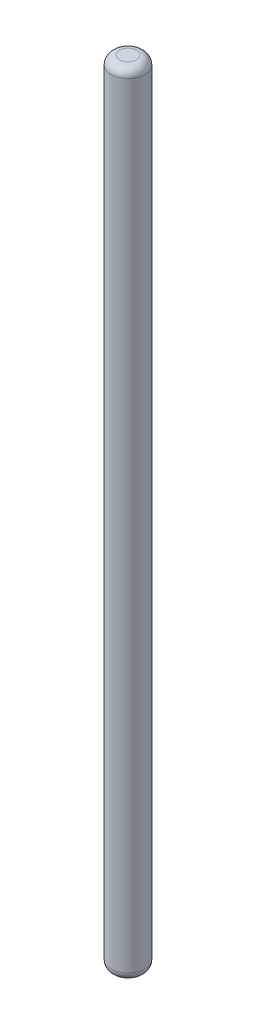
ISO-10303-21;
HEADER;
FILE_DESCRIPTION(('STEP AP214'),'2;1');
FILE_NAME('part.step','',(''),(''),'','','');
FILE_SCHEMA(('AUTOMOTIVE_DESIGN { 1 0 10303 214 1 1 1 1 }'));
ENDSEC;
DATA;
#1=APPLICATION_CONTEXT('core data for automotive mechanical design processes');
#2=APPLICATION_PROTOCOL_DEFINITION('international standard','automotive_design',2000,#1);
#3=PRODUCT_CONTEXT('',#1,'mechanical');
#4=PRODUCT('Part','Part','',(#3));
#5=PRODUCT_RELATED_PRODUCT_CATEGORY('part','',(#4));
#6=PRODUCT_DEFINITION_FORMATION('','',#4);
#7=PRODUCT_DEFINITION_CONTEXT('part definition',#1,'design');
#8=PRODUCT_DEFINITION('design','',#6,#7);
#9=PRODUCT_DEFINITION_SHAPE('','',#8);
#10=(LENGTH_UNIT() NAMED_UNIT(*) SI_UNIT(.MILLI.,.METRE.));
#11=(NAMED_UNIT(*) PLANE_ANGLE_UNIT() SI_UNIT($,.RADIAN.));
#12=(NAMED_UNIT(*) SI_UNIT($,.STERADIAN.) SOLID_ANGLE_UNIT());
#13=UNCERTAINTY_MEASURE_WITH_UNIT(LENGTH_MEASURE(1.E-05),#10,'distance_accuracy_value','');
#14=(GEOMETRIC_REPRESENTATION_CONTEXT(3) GLOBAL_UNCERTAINTY_ASSIGNED_CONTEXT((#13)) GLOBAL_UNIT_ASSIGNED_CONTEXT((#10,
#11,#12)) REPRESENTATION_CONTEXT('',''));
#15=CARTESIAN_POINT('',(0.,0.,0.));
#16=DIRECTION('',(0.,0.,1.));
#17=DIRECTION('',(1.,0.,0.));
#18=AXIS2_PLACEMENT_3D('',#15,#16,#17);
#19=CARTESIAN_POINT('',(0.,47.,0.));
#20=DIRECTION('',(0.,-1.,0.));
#21=DIRECTION('',(0.,0.,-1.));
#22=AXIS2_PLACEMENT_3D('',#19,#20,#21);
#23=CYLINDRICAL_SURFACE('',#22,1.);
#24=CARTESIAN_POINT('',(0.,0.5,0.));
#25=DIRECTION('',(0.,1.,0.));
#26=DIRECTION('',(0.,0.,1.));
#27=AXIS2_PLACEMENT_3D('',#24,#25,#26);
#28=CIRCLE('',#27,1.);
#29=CARTESIAN_POINT('',(0.,0.5,1.));
#30=VERTEX_POINT('',#29);
#31=EDGE_CURVE('E42',#30,#30,#28,.T.);
#32=ORIENTED_EDGE('',*,*,#31,.T.);
#33=EDGE_LOOP('',(#32));
#34=FACE_BOUND('',#33,.T.);
#35=CARTESIAN_POINT('',(0.,46.5,0.));
#36=DIRECTION('',(0.,1.,0.));
#37=DIRECTION('',(0.,0.,1.));
#38=AXIS2_PLACEMENT_3D('',#35,#36,#37);
#39=CIRCLE('',#38,1.);
#40=CARTESIAN_POINT('',(0.,46.5,1.));
#41=VERTEX_POINT('',#40);
#42=EDGE_CURVE('E46',#41,#41,#39,.F.);
#43=ORIENTED_EDGE('',*,*,#42,.T.);
#44=EDGE_LOOP('',(#43));
#45=FACE_BOUND('',#44,.T.);
#46=ADVANCED_FACE('F31',(#34,#45),#23,.T.);
#47=CARTESIAN_POINT('',(0.,47.,0.));
#48=DIRECTION('',(0.,1.,0.));
#49=DIRECTION('',(0.,0.,1.));
#50=AXIS2_PLACEMENT_3D('',#47,#48,#49);
#51=PLANE('',#50);
#52=CARTESIAN_POINT('',(0.,47.,0.));
#53=DIRECTION('',(0.,1.,0.));
#54=DIRECTION('',(0.,0.,1.));
#55=AXIS2_PLACEMENT_3D('',#52,#53,#54);
#56=CIRCLE('',#55,0.5);
#57=CARTESIAN_POINT('',(0.,47.,0.5));
#58=VERTEX_POINT('',#57);
#59=EDGE_CURVE('E10',#58,#58,#56,.T.);
#60=ORIENTED_EDGE('',*,*,#59,.T.);
#61=EDGE_LOOP('',(#60));
#62=FACE_BOUND('',#61,.T.);
#63=ADVANCED_FACE('F62',(#62),#51,.T.);
#64=CARTESIAN_POINT('',(0.,0.,0.));
#65=DIRECTION('',(0.,1.,0.));
#66=DIRECTION('',(0.,0.,1.));
#67=AXIS2_PLACEMENT_3D('',#64,#65,#66);
#68=PLANE('',#67);
#69=CARTESIAN_POINT('',(0.,0.,0.));
#70=DIRECTION('',(0.,1.,0.));
#71=DIRECTION('',(0.,0.,1.));
#72=AXIS2_PLACEMENT_3D('',#69,#70,#71);
#73=CIRCLE('',#72,0.5);
#74=CARTESIAN_POINT('',(0.,0.,0.5));
#75=VERTEX_POINT('',#74);
#76=EDGE_CURVE('E38',#75,#75,#73,.F.);
#77=ORIENTED_EDGE('',*,*,#76,.T.);
#78=EDGE_LOOP('',(#77));
#79=FACE_BOUND('',#78,.T.);
#80=ADVANCED_FACE('F59',(#79),#68,.F.);
#81=CARTESIAN_POINT('',(0.,0.5,0.));
#82=DIRECTION('',(0.,1.,0.));
#83=DIRECTION('',(0.,0.,1.));
#84=AXIS2_PLACEMENT_3D('',#81,#82,#83);
#85=DEGENERATE_TOROIDAL_SURFACE('',#84,0.5,0.5,.T.);
#86=ORIENTED_EDGE('',*,*,#76,.F.);
#87=EDGE_LOOP('',(#86));
#88=FACE_BOUND('',#87,.T.);
#89=ORIENTED_EDGE('',*,*,#31,.F.);
#90=EDGE_LOOP('',(#89));
#91=FACE_BOUND('',#90,.T.);
#92=ADVANCED_FACE('F55',(#88,#91),#85,.T.);
#93=CARTESIAN_POINT('',(0.,46.5,0.));
#94=DIRECTION('',(0.,1.,0.));
#95=DIRECTION('',(0.,0.,1.));
#96=AXIS2_PLACEMENT_3D('',#93,#94,#95);
#97=DEGENERATE_TOROIDAL_SURFACE('',#96,0.5,0.5,.T.);
#98=ORIENTED_EDGE('',*,*,#42,.F.);
#99=EDGE_LOOP('',(#98));
#100=FACE_BOUND('',#99,.T.);
#101=ORIENTED_EDGE('',*,*,#59,.F.);
#102=EDGE_LOOP('',(#101));
#103=FACE_BOUND('',#102,.T.);
#104=ADVANCED_FACE('F33',(#100,#103),#97,.T.);
#105=CLOSED_SHELL('',(#46,#63,#80,#92,#104));
#106=MANIFOLD_SOLID_BREP('B2',#105);
#107=ADVANCED_BREP_SHAPE_REPRESENTATION('',(#18,#106),#14);
#108=SHAPE_DEFINITION_REPRESENTATION(#9,#107);
ENDSEC;
END-ISO-10303-21;
